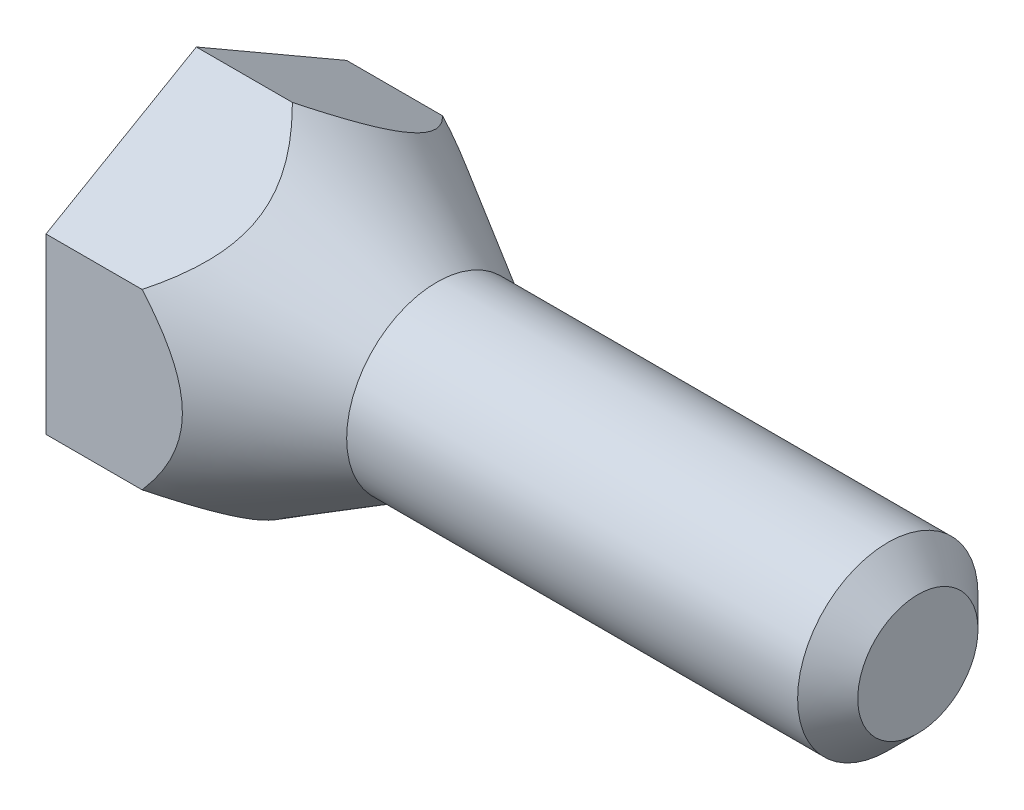
ISO-10303-21;
HEADER;
FILE_DESCRIPTION(('STEP AP214'),'2;1');
FILE_NAME('part.step','',(''),(''),'','','');
FILE_SCHEMA(('AUTOMOTIVE_DESIGN { 1 0 10303 214 1 1 1 1 }'));
ENDSEC;
DATA;
#1=APPLICATION_CONTEXT('core data for automotive mechanical design processes');
#2=APPLICATION_PROTOCOL_DEFINITION('international standard','automotive_design',2000,#1);
#3=PRODUCT_CONTEXT('',#1,'mechanical');
#4=PRODUCT('Part','Part','',(#3));
#5=PRODUCT_RELATED_PRODUCT_CATEGORY('part','',(#4));
#6=PRODUCT_DEFINITION_FORMATION('','',#4);
#7=PRODUCT_DEFINITION_CONTEXT('part definition',#1,'design');
#8=PRODUCT_DEFINITION('design','',#6,#7);
#9=PRODUCT_DEFINITION_SHAPE('','',#8);
#10=(LENGTH_UNIT() NAMED_UNIT(*) SI_UNIT(.MILLI.,.METRE.));
#11=(NAMED_UNIT(*) PLANE_ANGLE_UNIT() SI_UNIT($,.RADIAN.));
#12=(NAMED_UNIT(*) SI_UNIT($,.STERADIAN.) SOLID_ANGLE_UNIT());
#13=UNCERTAINTY_MEASURE_WITH_UNIT(LENGTH_MEASURE(1.E-05),#10,'distance_accuracy_value','');
#14=(GEOMETRIC_REPRESENTATION_CONTEXT(3) GLOBAL_UNCERTAINTY_ASSIGNED_CONTEXT((#13)) GLOBAL_UNIT_ASSIGNED_CONTEXT((#10,
#11,#12)) REPRESENTATION_CONTEXT('',''));
#15=CARTESIAN_POINT('',(0.,0.,0.));
#16=DIRECTION('',(0.,0.,1.));
#17=DIRECTION('',(1.,0.,0.));
#18=AXIS2_PLACEMENT_3D('',#15,#16,#17);
#19=CARTESIAN_POINT('',(24.,2.88675134594813,-5.));
#20=DIRECTION('',(0.,-0.866025403784439,0.5));
#21=DIRECTION('',(0.,-0.5,-0.866025403784439));
#22=AXIS2_PLACEMENT_3D('',#19,#20,#21);
#23=PLANE('',#22);
#24=CARTESIAN_POINT('',(3.19595242270517,2.88663587935726,-5.00019999400196));
#25=CARTESIAN_POINT('',(3.24824612995464,2.91682894812247,-4.9479040648642));
#26=CARTESIAN_POINT('',(3.29984239367416,2.94732328360857,-4.89508632645922));
#27=CARTESIAN_POINT('',(3.40144560990658,3.00898079963548,-4.78829237603212));
#28=CARTESIAN_POINT('',(3.45145210489282,3.04014416847399,-4.73431583786882));
#29=CARTESIAN_POINT('',(3.59925095289385,3.13503232269913,-4.56996473371444));
#30=CARTESIAN_POINT('',(3.69428555616147,3.19984876782183,-4.45769935759592));
#31=CARTESIAN_POINT('',(3.87696063740489,3.33452740456846,-4.22442911605664));
#32=CARTESIAN_POINT('',(3.96434663753677,3.40447669425922,-4.10327339235891));
#33=CARTESIAN_POINT('',(4.12519078729302,3.54816458451892,-3.85439866599672));
#34=CARTESIAN_POINT('',(4.19867973167039,3.62189433549504,-3.72669499127668));
#35=CARTESIAN_POINT('',(4.29797339005912,3.73875114565593,-3.52429305886759));
#36=CARTESIAN_POINT('',(4.3302454930197,3.78051025927691,-3.451964152397));
#37=CARTESIAN_POINT('',(4.38853443809237,3.86512221948354,-3.30541193839112));
#38=CARTESIAN_POINT('',(4.41455081186017,3.90797514769371,-3.23118848947801));
#39=CARTESIAN_POINT('',(4.45933376084498,3.99426336733352,-3.08173290896719));
#40=CARTESIAN_POINT('',(4.47815609792151,4.03769136297901,-3.00651341403833));
#41=CARTESIAN_POINT('',(4.50816058493453,4.12520097539653,-2.85494231918052));
#42=CARTESIAN_POINT('',(4.51934416425158,4.16928246830662,-2.77859093378677));
#43=CARTESIAN_POINT('',(4.53369077972207,4.25818365426074,-2.6246095628611));
#44=CARTESIAN_POINT('',(4.53677895035567,4.30300640652595,-2.54697427860268));
#45=CARTESIAN_POINT('',(4.5345848937603,4.39259963552136,-2.39179425396847));
#46=CARTESIAN_POINT('',(4.52930269535088,4.43737011243102,-2.31424951328185));
#47=CARTESIAN_POINT('',(4.51057437350823,4.52657646119425,-2.15973958486622));
#48=CARTESIAN_POINT('',(4.49711049956872,4.57101139225656,-2.08277602663549));
#49=CARTESIAN_POINT('',(4.46253772734708,4.65914883750212,-1.93011749342085));
#50=CARTESIAN_POINT('',(4.44142422621275,4.70285089410793,-1.85442331098435));
#51=CARTESIAN_POINT('',(4.38520341024463,4.80173845244731,-1.68314503570411));
#52=CARTESIAN_POINT('',(4.34781623410617,4.85659973304107,-1.58812251034743));
#53=CARTESIAN_POINT('',(4.26335164673753,4.96443105011229,-1.401353190533));
#54=CARTESIAN_POINT('',(4.21626825707981,5.01739989600678,-1.30960845822545));
#55=CARTESIAN_POINT('',(4.11393836656883,5.12157523185944,-1.12917148363309));
#56=CARTESIAN_POINT('',(4.05865968622417,5.1727737460873,-1.04049305571841));
#57=CARTESIAN_POINT('',(3.94159630969421,5.27324485466353,-0.866471990971616));
#58=CARTESIAN_POINT('',(3.87981268405707,5.32251776409286,-0.781128808403272));
#59=CARTESIAN_POINT('',(3.72095271957904,5.44184359601341,-0.574450404861451));
#60=CARTESIAN_POINT('',(3.62084146931789,5.5108859543589,-0.454865532332685));
#61=CARTESIAN_POINT('',(3.46499630417591,5.61159806804691,-0.280427034487405));
#62=CARTESIAN_POINT('',(3.4124145647302,5.64451528562271,-0.223412741202316));
#63=CARTESIAN_POINT('',(3.30546480139303,5.70960552009572,-0.110673148018495));
#64=CARTESIAN_POINT('',(3.25109714873399,5.74177868931619,-0.0549475842881239));
#65=CARTESIAN_POINT('',(3.19595242270664,5.77361815848628,0.000199994000486019));
#66=B_SPLINE_CURVE_WITH_KNOTS('',3,(#24,#25,#26,#27,#28,#29,#30,#31,#32,#33,#34,#35,#36,#37,#38,
#39,#40,#41,#42,#43,#44,#45,#46,#47,#48,#49,#50,#51,#52,#53,#54,#55,#56,#57,#58,#59,#60,#61,#62,
#63,#64,#65),.UNSPECIFIED.,.F.,.F.,(4,2,2,2,2,2,2,2,2,2,2,2,2,2,2,2,2,2,2,2,4),(0.,
0.239634840624783,0.479338033738259,0.961185761267876,1.45548280939225,1.94867136003306,
2.2170776598512,2.48550404804676,2.75180546619089,3.01805703978704,3.28676233353189,
3.55546670211445,3.8247561284194,4.09420785852345,4.44139198908011,4.78879082851692,
5.13759177546724,5.48633540813721,5.99751228585514,6.25025808496236,6.50295167494066),.UNSPECIFIED.);
#67=CARTESIAN_POINT('',(3.19615242270664,2.88675134594814,-5.));
#68=VERTEX_POINT('',#67);
#69=CARTESIAN_POINT('',(3.19615242270664,5.77350269189626,0.));
#70=VERTEX_POINT('',#69);
#71=EDGE_CURVE('E98',#68,#70,#66,.T.);
#72=ORIENTED_EDGE('',*,*,#71,.F.);
#73=DIRECTION('',(-1.,0.,0.));
#74=VECTOR('',#73,1.);
#75=CARTESIAN_POINT('',(24.,2.88675134594813,-5.));
#76=LINE('',#75,#74);
#77=CARTESIAN_POINT('',(0.,2.88675134594813,-5.));
#78=VERTEX_POINT('',#77);
#79=EDGE_CURVE('E63',#68,#78,#76,.T.);
#80=ORIENTED_EDGE('',*,*,#79,.T.);
#81=DIRECTION('',(0.,0.5,0.866025403784439));
#82=VECTOR('',#81,1.);
#83=CARTESIAN_POINT('',(0.,2.88675134594813,-5.));
#84=LINE('',#83,#82);
#85=CARTESIAN_POINT('',(0.,5.77350269189626,0.));
#86=VERTEX_POINT('',#85);
#87=EDGE_CURVE('E181',#78,#86,#84,.T.);
#88=ORIENTED_EDGE('',*,*,#87,.T.);
#89=DIRECTION('',(-1.,0.,0.));
#90=VECTOR('',#89,1.);
#91=CARTESIAN_POINT('',(24.,5.77350269189626,0.));
#92=LINE('',#91,#90);
#93=EDGE_CURVE('E116',#70,#86,#92,.T.);
#94=ORIENTED_EDGE('',*,*,#93,.F.);
#95=EDGE_LOOP('',(#72,#80,#88,#94));
#96=FACE_BOUND('',#95,.T.);
#97=ADVANCED_FACE('F40',(#96),#23,.F.);
#98=CARTESIAN_POINT('',(24.,5.77350269189626,0.));
#99=DIRECTION('',(0.,-0.866025403784439,-0.5));
#100=DIRECTION('',(0.,0.5,-0.866025403784439));
#101=AXIS2_PLACEMENT_3D('',#98,#99,#100);
#102=PLANE('',#101);
#103=CARTESIAN_POINT('',(3.19595242270664,5.77361815848628,-0.000199994000485936));
#104=CARTESIAN_POINT('',(3.24824612995609,5.74342508972107,0.0520959351372756));
#105=CARTESIAN_POINT('',(3.29984239367559,5.71293075423496,0.10491367354226));
#106=CARTESIAN_POINT('',(3.40144560990797,5.65127323820805,0.211707623969369));
#107=CARTESIAN_POINT('',(3.45145210489419,5.62010986936954,0.265684162132671));
#108=CARTESIAN_POINT('',(3.59925095289515,5.52522171514439,0.430035266287063));
#109=CARTESIAN_POINT('',(3.69428555616272,5.46040527002168,0.542300642405602));
#110=CARTESIAN_POINT('',(3.87696063740603,5.32572663327503,0.775570883944904));
#111=CARTESIAN_POINT('',(3.96434663753785,5.25577734358428,0.896726607642649));
#112=CARTESIAN_POINT('',(4.12519078729396,5.11208945332456,1.14560133400486));
#113=CARTESIAN_POINT('',(4.19867973167126,5.03835970234843,1.27330500872491));
#114=CARTESIAN_POINT('',(4.29797339005985,4.92150289218754,1.47570694113401));
#115=CARTESIAN_POINT('',(4.33024549302038,4.87974377856655,1.5480358476046));
#116=CARTESIAN_POINT('',(4.38853443809296,4.79513181835993,1.69458806161047));
#117=CARTESIAN_POINT('',(4.4145508118607,4.75227889014976,1.76881151052358));
#118=CARTESIAN_POINT('',(4.4593337608454,4.66599067050995,1.91826709103439));
#119=CARTESIAN_POINT('',(4.47815609792188,4.62256267486447,1.99348658596324));
#120=CARTESIAN_POINT('',(4.50816058493478,4.53505306244696,2.14505768082104));
#121=CARTESIAN_POINT('',(4.51934416425178,4.49097156953688,2.22140906621478));
#122=CARTESIAN_POINT('',(4.53369077972216,4.40207038358278,2.37539043714042));
#123=CARTESIAN_POINT('',(4.5367789503557,4.35724763131758,2.45302572139881));
#124=CARTESIAN_POINT('',(4.53458489376022,4.26765440232219,2.60820574603298));
#125=CARTESIAN_POINT('',(4.52930269535075,4.22288392541254,2.68575048671958));
#126=CARTESIAN_POINT('',(4.51057437350801,4.13367757664934,2.84026041513516));
#127=CARTESIAN_POINT('',(4.49711049956846,4.08924264558705,2.91722397336586));
#128=CARTESIAN_POINT('',(4.46253772734674,4.00110520034151,3.06988250658045));
#129=CARTESIAN_POINT('',(4.44142422621237,3.95740314373572,3.14557668901693));
#130=CARTESIAN_POINT('',(4.38520341024415,3.85851558539633,3.31685496429719));
#131=CARTESIAN_POINT('',(4.34781623410561,3.80365430480254,3.41187748965392));
#132=CARTESIAN_POINT('',(4.26335164673682,3.69582298773126,3.59864680946845));
#133=CARTESIAN_POINT('',(4.21626825707902,3.64285414183675,3.69039154177604));
#134=CARTESIAN_POINT('',(4.11393836656788,3.53867880598404,3.87082851636849));
#135=CARTESIAN_POINT('',(4.05865968622314,3.48748029175616,3.9595069442832));
#136=CARTESIAN_POINT('',(3.94159630969301,3.38700918317988,4.13352800903008));
#137=CARTESIAN_POINT('',(3.87981268405579,3.33773627375053,4.21887119159846));
#138=CARTESIAN_POINT('',(3.72095271957764,3.21841044182999,4.42554959514026));
#139=CARTESIAN_POINT('',(3.62084146931647,3.14936808348453,4.54513446766897));
#140=CARTESIAN_POINT('',(3.46499630417447,3.04865596979657,4.71957296551418));
#141=CARTESIAN_POINT('',(3.41241456472875,3.01573875222078,4.77658725879924));
#142=CARTESIAN_POINT('',(3.30546480139156,2.9506485177478,4.88932685198302));
#143=CARTESIAN_POINT('',(3.25109714873252,2.91847534852734,4.94505241571337));
#144=CARTESIAN_POINT('',(3.19595242270517,2.88663587935726,5.00019999400196));
#145=B_SPLINE_CURVE_WITH_KNOTS('',3,(#103,#104,#105,#106,#107,#108,#109,#110,#111,#112,#113,
#114,#115,#116,#117,#118,#119,#120,#121,#122,#123,#124,#125,#126,#127,#128,#129,#130,#131,#132,
#133,#134,#135,#136,#137,#138,#139,#140,#141,#142,#143,#144),.UNSPECIFIED.,.F.,.F.,(4,2,2,2,2,2,
2,2,2,2,2,2,2,2,2,2,2,2,2,2,4),(0.,0.239634840624754,0.479338033738201,0.961185761267763,
1.45548280939208,1.94867136003282,2.2170776598509,2.4855040480464,2.75180546619047,
3.01805703978656,3.28676233353134,3.55546670211383,3.82475612841871,4.0942078585227,
4.4413919890796,4.78879082851665,5.13759177546721,5.48633540813741,5.99751228585524,
6.25025808496241,6.50295167494066),.UNSPECIFIED.);
#146=CARTESIAN_POINT('',(3.19615242270664,2.88675134594813,5.));
#147=VERTEX_POINT('',#146);
#148=EDGE_CURVE('E93',#70,#147,#145,.T.);
#149=ORIENTED_EDGE('',*,*,#148,.F.);
#150=ORIENTED_EDGE('',*,*,#93,.T.);
#151=DIRECTION('',(0.,-0.5,0.866025403784439));
#152=VECTOR('',#151,1.);
#153=CARTESIAN_POINT('',(0.,5.77350269189626,0.));
#154=LINE('',#153,#152);
#155=CARTESIAN_POINT('',(0.,2.88675134594813,5.));
#156=VERTEX_POINT('',#155);
#157=EDGE_CURVE('E114',#86,#156,#154,.T.);
#158=ORIENTED_EDGE('',*,*,#157,.T.);
#159=DIRECTION('',(-1.,0.,0.));
#160=VECTOR('',#159,1.);
#161=CARTESIAN_POINT('',(24.,2.88675134594813,5.));
#162=LINE('',#161,#160);
#163=EDGE_CURVE('E107',#147,#156,#162,.T.);
#164=ORIENTED_EDGE('',*,*,#163,.F.);
#165=EDGE_LOOP('',(#149,#150,#158,#164));
#166=FACE_BOUND('',#165,.T.);
#167=ADVANCED_FACE('F112',(#166),#102,.F.);
#168=CARTESIAN_POINT('',(24.,2.88675134594813,5.));
#169=DIRECTION('',(0.,0.,-1.));
#170=DIRECTION('',(0.,1.,0.));
#171=AXIS2_PLACEMENT_3D('',#168,#169,#170);
#172=PLANE('',#171);
#173=CARTESIAN_POINT('',(0.774089514758835,-5.14158363700696,5.));
#174=CARTESIAN_POINT('',(0.906690215599008,-5.0347724665313,5.));
#175=CARTESIAN_POINT('',(1.03852975704215,-4.92700196847129,5.));
#176=CARTESIAN_POINT('',(1.30035400727573,-4.70916369212476,5.));
#177=CARTESIAN_POINT('',(1.43033821786376,-4.59909531563828,5.));
#178=CARTESIAN_POINT('',(1.68926041722354,-4.375291487327,5.));
#179=CARTESIAN_POINT('',(1.81817708086964,-4.26153128823909,5.));
#180=CARTESIAN_POINT('',(2.07317518448836,-4.03089230251624,5.));
#181=CARTESIAN_POINT('',(2.19925689225317,-3.91401381273745,5.));
#182=CARTESIAN_POINT('',(2.45625394550988,-3.66860530410776,5.));
#183=CARTESIAN_POINT('',(2.5869262530316,-3.53981960363976,5.));
#184=CARTESIAN_POINT('',(2.84317042547932,-3.27717316571977,5.));
#185=CARTESIAN_POINT('',(2.96874094459046,-3.14331110693594,5.));
#186=CARTESIAN_POINT('',(3.21263792316186,-2.87004983097419,5.));
#187=CARTESIAN_POINT('',(3.33099092115683,-2.73067445158727,5.));
#188=CARTESIAN_POINT('',(3.55862099185314,-2.44474925584374,5.));
#189=CARTESIAN_POINT('',(3.66790436500763,-2.29820453426928,5.));
#190=CARTESIAN_POINT('',(3.83762649159952,-2.04987959710284,5.));
#191=CARTESIAN_POINT('',(3.90168107692261,-1.95057618175388,5.));
#192=CARTESIAN_POINT('',(4.02337920106525,-1.74803265847929,5.));
#193=CARTESIAN_POINT('',(4.08102057901958,-1.64479123932248,5.));
#194=CARTESIAN_POINT('',(4.18782254054488,-1.4352449083697,5.));
#195=CARTESIAN_POINT('',(4.23706042885906,-1.3289797466525,5.));
#196=CARTESIAN_POINT('',(4.32597867081544,-1.1125168635472,5.));
#197=CARTESIAN_POINT('',(4.36566365733335,-1.00232107828882,5.));
#198=CARTESIAN_POINT('',(4.4243500636551,-0.809065690283616,5.));
#199=CARTESIAN_POINT('',(4.44604010162827,-0.726821079073892,5.));
#200=CARTESIAN_POINT('',(4.48274876021042,-0.560862955697903,5.));
#201=CARTESIAN_POINT('',(4.49776930621999,-0.477149874724728,5.));
#202=CARTESIAN_POINT('',(4.52061887582783,-0.308763655477054,5.));
#203=CARTESIAN_POINT('',(4.52844996312899,-0.224090799770949,5.));
#204=CARTESIAN_POINT('',(4.53663244782092,-0.0543796016711275,5.));
#205=CARTESIAN_POINT('',(4.53698369898657,0.03065874783521,5.));
#206=CARTESIAN_POINT('',(4.53018912191275,0.200425414084261,5.));
#207=CARTESIAN_POINT('',(4.52304421096711,0.285153767487712,5.));
#208=CARTESIAN_POINT('',(4.50153997413322,0.453701423568431,5.));
#209=CARTESIAN_POINT('',(4.48717767387815,0.537520336894591,5.));
#210=CARTESIAN_POINT('',(4.43395677769074,0.786857980357013,5.));
#211=CARTESIAN_POINT('',(4.38496309055164,0.950279899206035,5.));
#212=CARTESIAN_POINT('',(4.2783929260583,1.23442424823003,5.));
#213=CARTESIAN_POINT('',(4.22492949213387,1.35677008970268,5.));
#214=CARTESIAN_POINT('',(4.10740604201052,1.59633513971472,5.));
#215=CARTESIAN_POINT('',(4.04333891245874,1.71355083956535,5.));
#216=CARTESIAN_POINT('',(3.90613288646311,1.9442306368663,5.));
#217=CARTESIAN_POINT('',(3.83290188793098,2.05763923006318,5.));
#218=CARTESIAN_POINT('',(3.67980359254819,2.27976676135955,5.));
#219=CARTESIAN_POINT('',(3.59993949413637,2.38848792172983,5.));
#220=CARTESIAN_POINT('',(3.42893081124882,2.60960316820653,5.));
#221=CARTESIAN_POINT('',(3.3373882976073,2.72168763645527,5.));
#222=CARTESIAN_POINT('',(3.14951688331547,2.94178997034032,5.));
#223=CARTESIAN_POINT('',(3.05318687120884,3.04980688133316,5.));
#224=CARTESIAN_POINT('',(2.85662632563811,3.26241576375194,5.));
#225=CARTESIAN_POINT('',(2.75639201487718,3.36700422862009,5.));
#226=CARTESIAN_POINT('',(2.55282808314534,3.57313175612327,5.));
#227=CARTESIAN_POINT('',(2.44949815390426,3.67467051303029,5.));
#228=CARTESIAN_POINT('',(2.1345727218476,3.97645189681023,5.));
#229=CARTESIAN_POINT('',(1.91914248287344,4.1726928143261,5.));
#230=CARTESIAN_POINT('',(1.48137993091417,4.55698949512762,5.));
#231=CARTESIAN_POINT('',(1.25905129117345,4.74504949064662,5.));
#232=CARTESIAN_POINT('',(0.831311984018208,5.09678095676452,5.));
#233=CARTESIAN_POINT('',(0.626379362508941,5.26103601762593,5.));
#234=CARTESIAN_POINT('',(0.213257050022754,5.58545134131985,5.));
#235=CARTESIAN_POINT('',(0.00506686516017017,5.74561097334736,5.));
#236=CARTESIAN_POINT('',(-0.411267539344964,6.06060068498901,5.));
#237=CARTESIAN_POINT('',(-0.619380519533337,6.2154721710071,5.));
#238=CARTESIAN_POINT('',(-1.03757564380279,6.52241152759278,5.));
#239=CARTESIAN_POINT('',(-1.24765721778182,6.67448017418267,5.));
#240=CARTESIAN_POINT('',(-1.45852607280036,6.82543287532437,5.));
#241=B_SPLINE_CURVE_WITH_KNOTS('',3,(#173,#174,#175,#176,#177,#178,#179,#180,#181,#182,#183,
#184,#185,#186,#187,#188,#189,#190,#191,#192,#193,#194,#195,#196,#197,#198,#199,#200,#201,#202,
#203,#204,#205,#206,#207,#208,#209,#210,#211,#212,#213,#214,#215,#216,#217,#218,#219,#220,#221,
#222,#223,#224,#225,#226,#227,#228,#229,#230,#231,#232,#233,#234,#235,#236,#237,#238,#239,#240),
.UNSPECIFIED.,.F.,.F.,(4,2,2,2,2,2,2,2,2,2,2,2,2,2,2,2,2,2,2,2,2,2,2,2,2,2,2,2,2,2,2,2,2,4),(0.,
0.510816340733258,1.02176736122773,1.53752208781971,2.05322788937955,2.60352489682134,
3.15396613840148,3.70224337134982,4.25013648420362,4.60445655903989,4.95889565918437,
5.30987432688158,5.66068243578935,5.91560972238831,6.17046336667979,6.42524383344616,
6.68002928097265,6.93478355443191,7.18964290117988,7.69929548846625,8.09932103359501,
8.49961602655718,8.90431764867676,9.30882524675059,9.7428076711825,10.1768913231094,
10.6114059107089,11.045963913242,11.9198862493536,12.7933509682522,13.5811911530008,
14.3691519639424,15.1473732003065,15.9253756318382),.UNSPECIFIED.);
#242=CARTESIAN_POINT('',(3.19615242270664,-2.88675134594813,5.));
#243=VERTEX_POINT('',#242);
#244=EDGE_CURVE('E96',#147,#243,#241,.F.);
#245=ORIENTED_EDGE('',*,*,#244,.F.);
#246=ORIENTED_EDGE('',*,*,#163,.T.);
#247=DIRECTION('',(0.,-1.,0.));
#248=VECTOR('',#247,1.);
#249=CARTESIAN_POINT('',(0.,2.88675134594813,5.));
#250=LINE('',#249,#248);
#251=CARTESIAN_POINT('',(0.,-2.88675134594813,5.));
#252=VERTEX_POINT('',#251);
#253=EDGE_CURVE('E204',#156,#252,#250,.T.);
#254=ORIENTED_EDGE('',*,*,#253,.T.);
#255=DIRECTION('',(-1.,0.,0.));
#256=VECTOR('',#255,1.);
#257=CARTESIAN_POINT('',(24.,-2.88675134594813,5.));
#258=LINE('',#257,#256);
#259=EDGE_CURVE('E109',#243,#252,#258,.T.);
#260=ORIENTED_EDGE('',*,*,#259,.F.);
#261=EDGE_LOOP('',(#245,#246,#254,#260));
#262=FACE_BOUND('',#261,.T.);
#263=ADVANCED_FACE('F105',(#262),#172,.F.);
#264=CARTESIAN_POINT('',(24.,-2.88675134594813,5.));
#265=DIRECTION('',(0.,0.866025403784439,-0.5));
#266=DIRECTION('',(0.,0.5,0.866025403784439));
#267=AXIS2_PLACEMENT_3D('',#264,#265,#266);
#268=PLANE('',#267);
#269=CARTESIAN_POINT('',(3.19595242270517,-2.88663587935727,5.00019999400196));
#270=CARTESIAN_POINT('',(3.24824612995464,-2.91682894812247,4.9479040648642));
#271=CARTESIAN_POINT('',(3.29984239367416,-2.94732328360857,4.89508632645922));
#272=CARTESIAN_POINT('',(3.40144560990658,-3.00898079963549,4.78829237603212));
#273=CARTESIAN_POINT('',(3.45145210489282,-3.04014416847399,4.73431583786882));
#274=CARTESIAN_POINT('',(3.59925095289385,-3.13503232269913,4.56996473371444));
#275=CARTESIAN_POINT('',(3.69428555616147,-3.19984876782184,4.45769935759592));
#276=CARTESIAN_POINT('',(3.87696063740489,-3.33452740456847,4.22442911605664));
#277=CARTESIAN_POINT('',(3.96434663753677,-3.40447669425922,4.1032733923589));
#278=CARTESIAN_POINT('',(4.12519078729302,-3.54816458451892,3.85439866599672));
#279=CARTESIAN_POINT('',(4.19867973167039,-3.62189433549504,3.72669499127667));
#280=CARTESIAN_POINT('',(4.29797339005911,-3.73875114565593,3.52429305886758));
#281=CARTESIAN_POINT('',(4.3302454930197,-3.78051025927692,3.451964152397));
#282=CARTESIAN_POINT('',(4.38853443809237,-3.86512221948354,3.30541193839112));
#283=CARTESIAN_POINT('',(4.41455081186017,-3.90797514769371,3.23118848947801));
#284=CARTESIAN_POINT('',(4.45933376084498,-3.99426336733353,3.08173290896719));
#285=CARTESIAN_POINT('',(4.47815609792151,-4.03769136297901,3.00651341403832));
#286=CARTESIAN_POINT('',(4.50816058493453,-4.12520097539654,2.85494231918051));
#287=CARTESIAN_POINT('',(4.51934416425158,-4.16928246830662,2.77859093378676));
#288=CARTESIAN_POINT('',(4.53369077972207,-4.25818365426074,2.62460956286109));
#289=CARTESIAN_POINT('',(4.53677895035567,-4.30300640652595,2.54697427860268));
#290=CARTESIAN_POINT('',(4.5345848937603,-4.39259963552136,2.39179425396847));
#291=CARTESIAN_POINT('',(4.52930269535087,-4.43737011243103,2.31424951328185));
#292=CARTESIAN_POINT('',(4.51057437350823,-4.52657646119426,2.15973958486622));
#293=CARTESIAN_POINT('',(4.49711049956872,-4.57101139225656,2.08277602663549));
#294=CARTESIAN_POINT('',(4.46253772734708,-4.65914883750213,1.93011749342085));
#295=CARTESIAN_POINT('',(4.44142422621274,-4.70285089410793,1.85442331098434));
#296=CARTESIAN_POINT('',(4.38520341024463,-4.80173845244731,1.68314503570411));
#297=CARTESIAN_POINT('',(4.34781623410616,-4.85659973304107,1.58812251034743));
#298=CARTESIAN_POINT('',(4.26335164673753,-4.96443105011229,1.401353190533));
#299=CARTESIAN_POINT('',(4.2162682570798,-5.01739989600679,1.30960845822545));
#300=CARTESIAN_POINT('',(4.11393836656883,-5.12157523185945,1.12917148363309));
#301=CARTESIAN_POINT('',(4.05865968622417,-5.1727737460873,1.04049305571841));
#302=CARTESIAN_POINT('',(3.9415963096942,-5.27324485466353,0.866471990971613));
#303=CARTESIAN_POINT('',(3.87981268405706,-5.32251776409286,0.781128808403269));
#304=CARTESIAN_POINT('',(3.72095271957903,-5.44184359601341,0.574450404861449));
#305=CARTESIAN_POINT('',(3.62084146931789,-5.5108859543589,0.454865532332684));
#306=CARTESIAN_POINT('',(3.46499630417591,-5.61159806804691,0.280427034487406));
#307=CARTESIAN_POINT('',(3.4124145647302,-5.64451528562271,0.223412741202318));
#308=CARTESIAN_POINT('',(3.30546480139303,-5.70960552009572,0.110673148018499));
#309=CARTESIAN_POINT('',(3.25109714873399,-5.74177868931619,0.0549475842881284));
#310=CARTESIAN_POINT('',(3.19595242270664,-5.77361815848628,-0.00019999400048186));
#311=B_SPLINE_CURVE_WITH_KNOTS('',3,(#269,#270,#271,#272,#273,#274,#275,#276,#277,#278,#279,
#280,#281,#282,#283,#284,#285,#286,#287,#288,#289,#290,#291,#292,#293,#294,#295,#296,#297,#298,
#299,#300,#301,#302,#303,#304,#305,#306,#307,#308,#309,#310),.UNSPECIFIED.,.F.,.F.,(4,2,2,2,2,2,
2,2,2,2,2,2,2,2,2,2,2,2,2,2,4),(0.,0.239634840624783,0.479338033738259,0.961185761267877,
1.45548280939225,1.94867136003306,2.2170776598512,2.48550404804676,2.75180546619089,
3.01805703978704,3.28676233353189,3.55546670211445,3.8247561284194,4.09420785852345,
4.44139198908011,4.78879082851692,5.13759177546724,5.48633540813721,5.99751228585513,
6.25025808496235,6.50295167494065),.UNSPECIFIED.);
#312=CARTESIAN_POINT('',(3.19615242270664,-5.77350269189626,0.));
#313=VERTEX_POINT('',#312);
#314=EDGE_CURVE('E110',#243,#313,#311,.T.);
#315=ORIENTED_EDGE('',*,*,#314,.F.);
#316=ORIENTED_EDGE('',*,*,#259,.T.);
#317=DIRECTION('',(0.,-0.5,-0.866025403784438));
#318=VECTOR('',#317,1.);
#319=CARTESIAN_POINT('',(0.,-2.88675134594813,5.));
#320=LINE('',#319,#318);
#321=CARTESIAN_POINT('',(0.,-5.77350269189626,0.));
#322=VERTEX_POINT('',#321);
#323=EDGE_CURVE('E201',#252,#322,#320,.T.);
#324=ORIENTED_EDGE('',*,*,#323,.T.);
#325=DIRECTION('',(-1.,0.,0.));
#326=VECTOR('',#325,1.);
#327=CARTESIAN_POINT('',(24.,-5.77350269189626,0.));
#328=LINE('',#327,#326);
#329=EDGE_CURVE('E120',#313,#322,#328,.T.);
#330=ORIENTED_EDGE('',*,*,#329,.F.);
#331=EDGE_LOOP('',(#315,#316,#324,#330));
#332=FACE_BOUND('',#331,.T.);
#333=ADVANCED_FACE('F202',(#332),#268,.F.);
#334=CARTESIAN_POINT('',(24.,-5.77350269189626,0.));
#335=DIRECTION('',(0.,0.866025403784439,0.5));
#336=DIRECTION('',(0.,-0.5,0.866025403784439));
#337=AXIS2_PLACEMENT_3D('',#334,#335,#336);
#338=PLANE('',#337);
#339=CARTESIAN_POINT('',(3.19595242270664,-5.77361815848628,0.000199994000489909));
#340=CARTESIAN_POINT('',(3.24824612995609,-5.74342508972107,-0.052095935137271));
#341=CARTESIAN_POINT('',(3.29984239367559,-5.71293075423496,-0.104913673542255));
#342=CARTESIAN_POINT('',(3.40144560990797,-5.65127323820805,-0.211707623969364));
#343=CARTESIAN_POINT('',(3.45145210489419,-5.62010986936954,-0.265684162132666));
#344=CARTESIAN_POINT('',(3.59925095289515,-5.52522171514439,-0.430035266287058));
#345=CARTESIAN_POINT('',(3.69428555616272,-5.46040527002168,-0.542300642405597));
#346=CARTESIAN_POINT('',(3.87696063740603,-5.32572663327503,-0.775570883944899));
#347=CARTESIAN_POINT('',(3.96434663753785,-5.25577734358428,-0.896726607642644));
#348=CARTESIAN_POINT('',(4.12519078729396,-5.11208945332456,-1.14560133400485));
#349=CARTESIAN_POINT('',(4.19867973167126,-5.03835970234843,-1.27330500872491));
#350=CARTESIAN_POINT('',(4.29797339005985,-4.92150289218754,-1.47570694113401));
#351=CARTESIAN_POINT('',(4.33024549302039,-4.87974377856655,-1.5480358476046));
#352=CARTESIAN_POINT('',(4.38853443809296,-4.79513181835993,-1.69458806161047));
#353=CARTESIAN_POINT('',(4.4145508118607,-4.75227889014976,-1.76881151052357));
#354=CARTESIAN_POINT('',(4.4593337608454,-4.66599067050995,-1.91826709103439));
#355=CARTESIAN_POINT('',(4.47815609792188,-4.62256267486447,-1.99348658596324));
#356=CARTESIAN_POINT('',(4.50816058493479,-4.53505306244696,-2.14505768082103));
#357=CARTESIAN_POINT('',(4.51934416425178,-4.49097156953688,-2.22140906621477));
#358=CARTESIAN_POINT('',(4.53369077972216,-4.40207038358278,-2.37539043714041));
#359=CARTESIAN_POINT('',(4.53677895035571,-4.35724763131758,-2.45302572139881));
#360=CARTESIAN_POINT('',(4.53458489376023,-4.26765440232219,-2.60820574603298));
#361=CARTESIAN_POINT('',(4.52930269535075,-4.22288392541254,-2.68575048671958));
#362=CARTESIAN_POINT('',(4.51057437350801,-4.13367757664934,-2.84026041513516));
#363=CARTESIAN_POINT('',(4.49711049956846,-4.08924264558705,-2.91722397336586));
#364=CARTESIAN_POINT('',(4.46253772734674,-4.00110520034151,-3.06988250658045));
#365=CARTESIAN_POINT('',(4.44142422621237,-3.95740314373572,-3.14557668901693));
#366=CARTESIAN_POINT('',(4.38520341024416,-3.85851558539633,-3.31685496429719));
#367=CARTESIAN_POINT('',(4.34781623410562,-3.80365430480254,-3.41187748965392));
#368=CARTESIAN_POINT('',(4.26335164673682,-3.69582298773127,-3.59864680946844));
#369=CARTESIAN_POINT('',(4.21626825707902,-3.64285414183675,-3.69039154177604));
#370=CARTESIAN_POINT('',(4.11393836656788,-3.53867880598404,-3.87082851636848));
#371=CARTESIAN_POINT('',(4.05865968622314,-3.48748029175616,-3.9595069442832));
#372=CARTESIAN_POINT('',(3.94159630969301,-3.38700918317988,-4.13352800903008));
#373=CARTESIAN_POINT('',(3.8798126840558,-3.33773627375053,-4.21887119159846));
#374=CARTESIAN_POINT('',(3.72095271957765,-3.21841044182999,-4.42554959514026));
#375=CARTESIAN_POINT('',(3.62084146931648,-3.14936808348453,-4.54513446766897));
#376=CARTESIAN_POINT('',(3.46499630417447,-3.04865596979657,-4.71957296551418));
#377=CARTESIAN_POINT('',(3.41241456472875,-3.01573875222078,-4.77658725879924));
#378=CARTESIAN_POINT('',(3.30546480139157,-2.9506485177478,-4.88932685198302));
#379=CARTESIAN_POINT('',(3.25109714873252,-2.91847534852734,-4.94505241571337));
#380=CARTESIAN_POINT('',(3.19595242270517,-2.88663587935726,-5.00019999400196));
#381=B_SPLINE_CURVE_WITH_KNOTS('',3,(#339,#340,#341,#342,#343,#344,#345,#346,#347,#348,#349,
#350,#351,#352,#353,#354,#355,#356,#357,#358,#359,#360,#361,#362,#363,#364,#365,#366,#367,#368,
#369,#370,#371,#372,#373,#374,#375,#376,#377,#378,#379,#380),.UNSPECIFIED.,.F.,.F.,(4,2,2,2,2,2,
2,2,2,2,2,2,2,2,2,2,2,2,2,2,4),(0.,0.239634840624753,0.4793380337382,0.961185761267762,
1.45548280939208,1.94867136003282,2.2170776598509,2.4855040480464,2.75180546619047,
3.01805703978656,3.28676233353134,3.55546670211383,3.82475612841872,4.0942078585227,
4.4413919890796,4.78879082851665,5.13759177546721,5.48633540813741,5.99751228585524,
6.25025808496241,6.50295167494066),.UNSPECIFIED.);
#382=CARTESIAN_POINT('',(3.19615242270665,-2.88675134594813,-5.));
#383=VERTEX_POINT('',#382);
#384=EDGE_CURVE('E55',#313,#383,#381,.T.);
#385=ORIENTED_EDGE('',*,*,#384,.F.);
#386=ORIENTED_EDGE('',*,*,#329,.T.);
#387=DIRECTION('',(0.,0.5,-0.866025403784439));
#388=VECTOR('',#387,1.);
#389=CARTESIAN_POINT('',(0.,-5.77350269189626,0.));
#390=LINE('',#389,#388);
#391=CARTESIAN_POINT('',(0.,-2.88675134594813,-5.));
#392=VERTEX_POINT('',#391);
#393=EDGE_CURVE('E190',#322,#392,#390,.T.);
#394=ORIENTED_EDGE('',*,*,#393,.T.);
#395=DIRECTION('',(-1.,0.,0.));
#396=VECTOR('',#395,1.);
#397=CARTESIAN_POINT('',(24.,-2.88675134594813,-5.));
#398=LINE('',#397,#396);
#399=EDGE_CURVE('E187',#383,#392,#398,.T.);
#400=ORIENTED_EDGE('',*,*,#399,.F.);
#401=EDGE_LOOP('',(#385,#386,#394,#400));
#402=FACE_BOUND('',#401,.T.);
#403=ADVANCED_FACE('F197',(#402),#338,.F.);
#404=CARTESIAN_POINT('',(24.,-2.88675134594813,-5.));
#405=DIRECTION('',(0.,0.,1.));
#406=DIRECTION('',(1.,0.,0.));
#407=AXIS2_PLACEMENT_3D('',#404,#405,#406);
#408=PLANE('',#407);
#409=CARTESIAN_POINT('',(0.774089514758815,-5.14158363700698,-5.));
#410=CARTESIAN_POINT('',(0.906690215598988,-5.03477246653132,-5.));
#411=CARTESIAN_POINT('',(1.03852975704213,-4.92700196847131,-5.));
#412=CARTESIAN_POINT('',(1.30035400727571,-4.70916369212478,-5.));
#413=CARTESIAN_POINT('',(1.43033821786375,-4.5990953156383,-5.));
#414=CARTESIAN_POINT('',(1.68926041722353,-4.37529148732702,-5.));
#415=CARTESIAN_POINT('',(1.81817708086963,-4.26153128823911,-5.));
#416=CARTESIAN_POINT('',(2.07317518448835,-4.03089230251625,-5.));
#417=CARTESIAN_POINT('',(2.19925689225316,-3.91401381273746,-5.));
#418=CARTESIAN_POINT('',(2.45625394550987,-3.66860530410777,-5.));
#419=CARTESIAN_POINT('',(2.58692625303159,-3.53981960363977,-5.));
#420=CARTESIAN_POINT('',(2.84317042547931,-3.27717316571978,-5.));
#421=CARTESIAN_POINT('',(2.96874094459045,-3.14331110693595,-5.));
#422=CARTESIAN_POINT('',(3.21263792316186,-2.8700498309742,-5.));
#423=CARTESIAN_POINT('',(3.33099092115683,-2.73067445158728,-5.));
#424=CARTESIAN_POINT('',(3.55862099185315,-2.44474925584375,-5.));
#425=CARTESIAN_POINT('',(3.66790436500763,-2.29820453426929,-5.));
#426=CARTESIAN_POINT('',(3.83762649159952,-2.04987959710284,-5.));
#427=CARTESIAN_POINT('',(3.90168107692262,-1.95057618175389,-5.));
#428=CARTESIAN_POINT('',(4.02337920106526,-1.74803265847929,-5.));
#429=CARTESIAN_POINT('',(4.08102057901959,-1.64479123932248,-5.));
#430=CARTESIAN_POINT('',(4.18782254054489,-1.43524490836971,-5.));
#431=CARTESIAN_POINT('',(4.23706042885906,-1.32897974665251,-5.));
#432=CARTESIAN_POINT('',(4.32597867081545,-1.1125168635472,-5.));
#433=CARTESIAN_POINT('',(4.36566365733336,-1.00232107828882,-5.));
#434=CARTESIAN_POINT('',(4.42435006365511,-0.809065690283619,-5.));
#435=CARTESIAN_POINT('',(4.44604010162828,-0.726821079073895,-5.));
#436=CARTESIAN_POINT('',(4.48274876021043,-0.560862955697906,-5.));
#437=CARTESIAN_POINT('',(4.49776930622,-0.477149874724731,-5.));
#438=CARTESIAN_POINT('',(4.52061887582784,-0.308763655477057,-5.));
#439=CARTESIAN_POINT('',(4.528449963129,-0.224090799770952,-5.));
#440=CARTESIAN_POINT('',(4.53663244782093,-0.0543796016711306,-5.));
#441=CARTESIAN_POINT('',(4.53698369898659,0.030658747835207,-5.));
#442=CARTESIAN_POINT('',(4.53018912191277,0.200425414084258,-5.));
#443=CARTESIAN_POINT('',(4.52304421096712,0.285153767487709,-5.));
#444=CARTESIAN_POINT('',(4.50153997413323,0.453701423568427,-5.));
#445=CARTESIAN_POINT('',(4.48717767387816,0.537520336894587,-5.));
#446=CARTESIAN_POINT('',(4.43395677769075,0.78685798035701,-5.));
#447=CARTESIAN_POINT('',(4.38496309055165,0.950279899206032,-5.));
#448=CARTESIAN_POINT('',(4.27839292605832,1.23442424823003,-5.));
#449=CARTESIAN_POINT('',(4.22492949213388,1.35677008970267,-5.));
#450=CARTESIAN_POINT('',(4.10740604201053,1.59633513971472,-5.));
#451=CARTESIAN_POINT('',(4.04333891245876,1.71355083956535,-5.));
#452=CARTESIAN_POINT('',(3.90613288646312,1.9442306368663,-5.));
#453=CARTESIAN_POINT('',(3.832901887931,2.05763923006317,-5.));
#454=CARTESIAN_POINT('',(3.6798035925482,2.27976676135954,-5.));
#455=CARTESIAN_POINT('',(3.59993949413639,2.38848792172982,-5.));
#456=CARTESIAN_POINT('',(3.42893081124884,2.60960316820652,-5.));
#457=CARTESIAN_POINT('',(3.33738829760732,2.72168763645526,-5.));
#458=CARTESIAN_POINT('',(3.14951688331549,2.94178997034031,-5.));
#459=CARTESIAN_POINT('',(3.05318687120886,3.04980688133315,-5.));
#460=CARTESIAN_POINT('',(2.85662632563813,3.26241576375193,-5.));
#461=CARTESIAN_POINT('',(2.7563920148772,3.36700422862008,-5.));
#462=CARTESIAN_POINT('',(2.55282808314536,3.57313175612326,-5.));
#463=CARTESIAN_POINT('',(2.44949815390428,3.67467051303027,-5.));
#464=CARTESIAN_POINT('',(2.13457272184762,3.97645189681021,-5.));
#465=CARTESIAN_POINT('',(1.91914248287346,4.17269281432609,-5.));
#466=CARTESIAN_POINT('',(1.4813799309142,4.5569894951276,-5.));
#467=CARTESIAN_POINT('',(1.25905129117348,4.7450494906466,-5.));
#468=CARTESIAN_POINT('',(0.831311984018243,5.0967809567645,-5.));
#469=CARTESIAN_POINT('',(0.626379362508976,5.26103601762591,-5.));
#470=CARTESIAN_POINT('',(0.213257050022793,5.58545134131983,-5.));
#471=CARTESIAN_POINT('',(0.00506686516021037,5.74561097334734,-5.));
#472=CARTESIAN_POINT('',(-0.41126753934492,6.06060068498899,-5.));
#473=CARTESIAN_POINT('',(-0.619380519533292,6.21547217100708,-5.));
#474=CARTESIAN_POINT('',(-1.03757564380274,6.52241152759275,-5.));
#475=CARTESIAN_POINT('',(-1.24765721778177,6.67448017418264,-5.));
#476=CARTESIAN_POINT('',(-1.45852607280031,6.82543287532434,-5.));
#477=B_SPLINE_CURVE_WITH_KNOTS('',3,(#409,#410,#411,#412,#413,#414,#415,#416,#417,#418,#419,
#420,#421,#422,#423,#424,#425,#426,#427,#428,#429,#430,#431,#432,#433,#434,#435,#436,#437,#438,
#439,#440,#441,#442,#443,#444,#445,#446,#447,#448,#449,#450,#451,#452,#453,#454,#455,#456,#457,
#458,#459,#460,#461,#462,#463,#464,#465,#466,#467,#468,#469,#470,#471,#472,#473,#474,#475,#476),
.UNSPECIFIED.,.F.,.F.,(4,2,2,2,2,2,2,2,2,2,2,2,2,2,2,2,2,2,2,2,2,2,2,2,2,2,2,2,2,2,2,2,2,4),(0.,
0.510816340733261,1.02176736122774,1.53752208781972,2.05322788937957,2.60352489682135,
3.1539661384015,3.70224337134985,4.25013648420365,4.60445655903992,4.9588956591844,
5.30987432688161,5.66068243578938,5.91560972238834,6.17046336667983,6.4252438334462,
6.68002928097268,6.93478355443195,7.18964290117991,7.69929548846628,8.09932103359504,
8.49961602655721,8.90431764867679,9.30882524675061,9.74280767118252,10.1768913231094,
10.6114059107089,11.0459639132421,11.9198862493536,12.7933509682522,13.5811911530009,
14.3691519639424,15.1473732003065,15.9253756318382),.UNSPECIFIED.);
#478=EDGE_CURVE('E118',#383,#68,#477,.T.);
#479=ORIENTED_EDGE('',*,*,#478,.F.);
#480=ORIENTED_EDGE('',*,*,#399,.T.);
#481=DIRECTION('',(0.,1.,0.));
#482=VECTOR('',#481,1.);
#483=CARTESIAN_POINT('',(0.,-2.88675134594813,-5.));
#484=LINE('',#483,#482);
#485=EDGE_CURVE('E185',#392,#78,#484,.T.);
#486=ORIENTED_EDGE('',*,*,#485,.T.);
#487=ORIENTED_EDGE('',*,*,#79,.F.);
#488=EDGE_LOOP('',(#479,#480,#486,#487));
#489=FACE_BOUND('',#488,.T.);
#490=ADVANCED_FACE('F130',(#489),#408,.F.);
#491=CARTESIAN_POINT('',(0.,0.,0.));
#492=DIRECTION('',(1.,0.,0.));
#493=DIRECTION('',(0.,0.,-1.));
#494=AXIS2_PLACEMENT_3D('',#491,#492,#493);
#495=PLANE('',#494);
#496=ORIENTED_EDGE('',*,*,#87,.F.);
#497=ORIENTED_EDGE('',*,*,#485,.F.);
#498=ORIENTED_EDGE('',*,*,#393,.F.);
#499=ORIENTED_EDGE('',*,*,#323,.F.);
#500=ORIENTED_EDGE('',*,*,#253,.F.);
#501=ORIENTED_EDGE('',*,*,#157,.F.);
#502=EDGE_LOOP('',(#496,#497,#498,#499,#500,#501));
#503=FACE_BOUND('',#502,.T.);
#504=ADVANCED_FACE('F138',(#503),#495,.F.);
#505=CARTESIAN_POINT('',(3.19615242270664,0.,0.));
#506=DIRECTION('',(-1.,0.,0.));
#507=DIRECTION('',(0.,0.,1.));
#508=AXIS2_PLACEMENT_3D('',#505,#506,#507);
#509=CONICAL_SURFACE('',#508,5.77350269189626,0.5235987755983);
#510=CARTESIAN_POINT('',(8.,0.,0.));
#511=DIRECTION('',(-1.,0.,0.));
#512=DIRECTION('',(0.,0.,1.));
#513=AXIS2_PLACEMENT_3D('',#510,#511,#512);
#514=CIRCLE('',#513,3.);
#515=CARTESIAN_POINT('',(8.,0.,3.));
#516=VERTEX_POINT('',#515);
#517=EDGE_CURVE('E228',#516,#516,#514,.T.);
#518=ORIENTED_EDGE('',*,*,#517,.T.);
#519=EDGE_LOOP('',(#518));
#520=FACE_BOUND('',#519,.T.);
#521=ORIENTED_EDGE('',*,*,#71,.T.);
#522=ORIENTED_EDGE('',*,*,#148,.T.);
#523=ORIENTED_EDGE('',*,*,#244,.T.);
#524=ORIENTED_EDGE('',*,*,#314,.T.);
#525=ORIENTED_EDGE('',*,*,#384,.T.);
#526=ORIENTED_EDGE('',*,*,#478,.T.);
#527=EDGE_LOOP('',(#521,#522,#523,#524,#525,#526));
#528=FACE_BOUND('',#527,.T.);
#529=ADVANCED_FACE('F95',(#520,#528),#509,.T.);
#530=CARTESIAN_POINT('',(0.,0.,0.));
#531=DIRECTION('',(-1.,0.,0.));
#532=DIRECTION('',(0.,0.,1.));
#533=AXIS2_PLACEMENT_3D('',#530,#531,#532);
#534=CYLINDRICAL_SURFACE('',#533,3.);
#535=CARTESIAN_POINT('',(23.,0.,0.));
#536=DIRECTION('',(1.,0.,0.));
#537=DIRECTION('',(0.,0.,-1.));
#538=AXIS2_PLACEMENT_3D('',#535,#536,#537);
#539=CIRCLE('',#538,3.);
#540=CARTESIAN_POINT('',(23.,0.,-3.));
#541=VERTEX_POINT('',#540);
#542=EDGE_CURVE('E48',#541,#541,#539,.F.);
#543=ORIENTED_EDGE('',*,*,#542,.T.);
#544=EDGE_LOOP('',(#543));
#545=FACE_BOUND('',#544,.T.);
#546=ORIENTED_EDGE('',*,*,#517,.F.);
#547=EDGE_LOOP('',(#546));
#548=FACE_BOUND('',#547,.T.);
#549=ADVANCED_FACE('F137',(#545,#548),#534,.T.);
#550=CARTESIAN_POINT('',(24.,0.,0.));
#551=DIRECTION('',(1.,0.,0.));
#552=DIRECTION('',(0.,0.,-1.));
#553=AXIS2_PLACEMENT_3D('',#550,#551,#552);
#554=PLANE('',#553);
#555=CARTESIAN_POINT('',(24.,0.,0.));
#556=DIRECTION('',(1.,0.,0.));
#557=DIRECTION('',(0.,0.,-1.));
#558=AXIS2_PLACEMENT_3D('',#555,#556,#557);
#559=CIRCLE('',#558,2.00000000000001);
#560=CARTESIAN_POINT('',(24.,0.,-2.00000000000001));
#561=VERTEX_POINT('',#560);
#562=EDGE_CURVE('E11',#561,#561,#559,.T.);
#563=ORIENTED_EDGE('',*,*,#562,.T.);
#564=EDGE_LOOP('',(#563));
#565=FACE_BOUND('',#564,.T.);
#566=ADVANCED_FACE('F212',(#565),#554,.T.);
#567=CARTESIAN_POINT('',(23.,0.,0.));
#568=DIRECTION('',(-1.,0.,0.));
#569=DIRECTION('',(0.,0.,1.));
#570=AXIS2_PLACEMENT_3D('',#567,#568,#569);
#571=CONICAL_SURFACE('',#570,3.,0.78539816339745);
#572=ORIENTED_EDGE('',*,*,#562,.F.);
#573=EDGE_LOOP('',(#572));
#574=FACE_BOUND('',#573,.T.);
#575=ORIENTED_EDGE('',*,*,#542,.F.);
#576=EDGE_LOOP('',(#575));
#577=FACE_BOUND('',#576,.T.);
#578=ADVANCED_FACE('F42',(#574,#577),#571,.T.);
#579=CLOSED_SHELL('',(#97,#167,#263,#333,#403,#490,#504,#529,#549,#566,#578));
#580=MANIFOLD_SOLID_BREP('B2',#579);
#581=ADVANCED_BREP_SHAPE_REPRESENTATION('',(#18,#580),#14);
#582=SHAPE_DEFINITION_REPRESENTATION(#9,#581);
ENDSEC;
END-ISO-10303-21;
